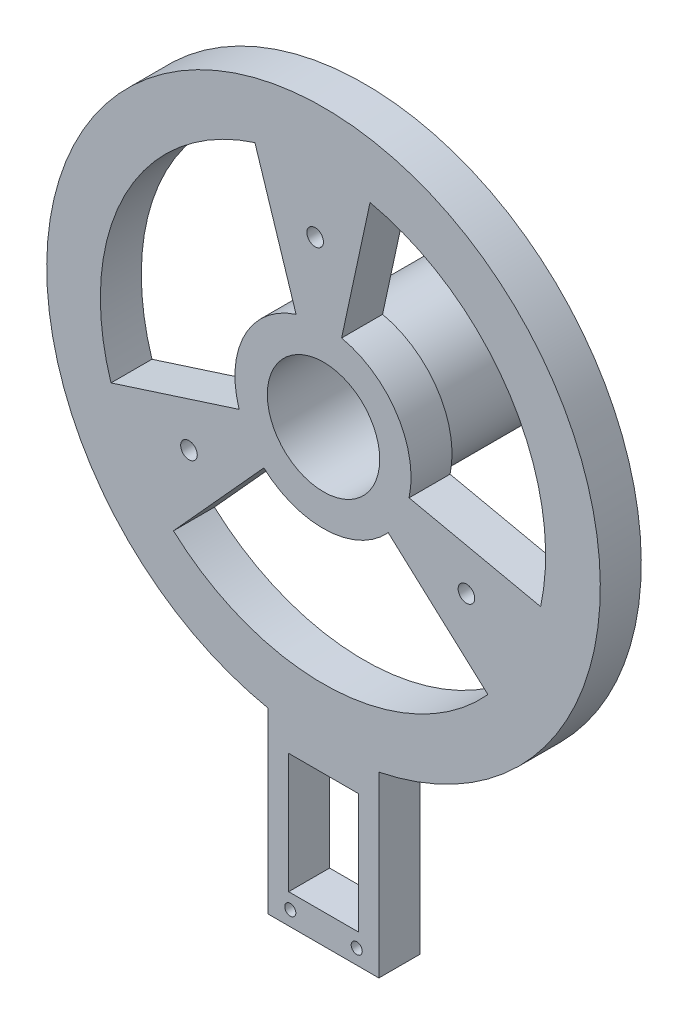
ISO-10303-21;
HEADER;
FILE_DESCRIPTION(('STEP AP214'),'2;1');
FILE_NAME('part.step','',(''),(''),'','','');
FILE_SCHEMA(('AUTOMOTIVE_DESIGN { 1 0 10303 214 1 1 1 1 }'));
ENDSEC;
DATA;
#1=APPLICATION_CONTEXT('core data for automotive mechanical design processes');
#2=APPLICATION_PROTOCOL_DEFINITION('international standard','automotive_design',2000,#1);
#3=PRODUCT_CONTEXT('',#1,'mechanical');
#4=PRODUCT('Part','Part','',(#3));
#5=PRODUCT_RELATED_PRODUCT_CATEGORY('part','',(#4));
#6=PRODUCT_DEFINITION_FORMATION('','',#4);
#7=PRODUCT_DEFINITION_CONTEXT('part definition',#1,'design');
#8=PRODUCT_DEFINITION('design','',#6,#7);
#9=PRODUCT_DEFINITION_SHAPE('','',#8);
#10=(LENGTH_UNIT() NAMED_UNIT(*) SI_UNIT(.MILLI.,.METRE.));
#11=(NAMED_UNIT(*) PLANE_ANGLE_UNIT() SI_UNIT($,.RADIAN.));
#12=(NAMED_UNIT(*) SI_UNIT($,.STERADIAN.) SOLID_ANGLE_UNIT());
#13=UNCERTAINTY_MEASURE_WITH_UNIT(LENGTH_MEASURE(1.E-05),#10,'distance_accuracy_value','');
#14=(GEOMETRIC_REPRESENTATION_CONTEXT(3) GLOBAL_UNCERTAINTY_ASSIGNED_CONTEXT((#13)) GLOBAL_UNIT_ASSIGNED_CONTEXT((#10,
#11,#12)) REPRESENTATION_CONTEXT('',''));
#15=CARTESIAN_POINT('',(0.,0.,0.));
#16=DIRECTION('',(0.,0.,1.));
#17=DIRECTION('',(1.,0.,0.));
#18=AXIS2_PLACEMENT_3D('',#15,#16,#17);
#19=CARTESIAN_POINT('',(6.10000000000001,74.3,5.));
#20=DIRECTION('',(0.,0.,1.));
#21=DIRECTION('',(1.,0.,0.));
#22=AXIS2_PLACEMENT_3D('',#19,#20,#21);
#23=PLANE('',#22);
#24=DIRECTION('',(-0.952103066891042,-0.305777288261689,0.));
#25=VECTOR('',#24,1.);
#26=CARTESIAN_POINT('',(-9.14217656474021,69.4350148088019,5.));
#27=LINE('',#26,#25);
#28=CARTESIAN_POINT('',(-9.14217656474021,69.4350148088019,5.));
#29=VERTEX_POINT('',#28);
#30=CARTESIAN_POINT('',(-32.2881338884713,62.0014623807209,5.));
#31=VERTEX_POINT('',#30);
#32=EDGE_CURVE('E203',#29,#31,#27,.T.);
#33=ORIENTED_EDGE('',*,*,#32,.T.);
#34=CARTESIAN_POINT('',(6.00499750192864,74.2996791208893,5.));
#35=DIRECTION('',(0.,0.,1.));
#36=DIRECTION('',(1.,0.,0.));
#37=AXIS2_PLACEMENT_3D('',#34,#35,#36);
#38=CIRCLE('',#37,40.2195232029246);
#39=CARTESIAN_POINT('',(-6.29321923824014,112.592810511289,5.));
#40=VERTEX_POINT('',#39);
#41=EDGE_CURVE('E195',#31,#40,#38,.F.);
#42=ORIENTED_EDGE('',*,*,#41,.T.);
#43=DIRECTION('',(0.305777288261699,-0.952103066891039,0.));
#44=VECTOR('',#43,1.);
#45=CARTESIAN_POINT('',(1.14033318984112,89.446853187558,5.));
#46=LINE('',#45,#44);
#47=CARTESIAN_POINT('',(1.14033318984112,89.446853187558,5.));
#48=VERTEX_POINT('',#47);
#49=EDGE_CURVE('E182',#40,#48,#46,.T.);
#50=ORIENTED_EDGE('',*,*,#49,.T.);
#51=CARTESIAN_POINT('',(6.00499750192864,74.2996791208893,5.));
#52=DIRECTION('',(0.,0.,1.));
#53=DIRECTION('',(1.,0.,0.));
#54=AXIS2_PLACEMENT_3D('',#51,#52,#53);
#55=CIRCLE('',#54,15.9091747452614);
#56=EDGE_CURVE('E209',#48,#29,#55,.T.);
#57=ORIENTED_EDGE('',*,*,#56,.T.);
#58=EDGE_LOOP('',(#33,#42,#50,#57));
#59=FACE_BOUND('',#58,.T.);
#60=CARTESIAN_POINT('',(31.9176827119807,61.1410219315247,5.));
#61=DIRECTION('',(0.,0.,1.));
#62=DIRECTION('',(1.,0.,0.));
#63=AXIS2_PLACEMENT_3D('',#60,#61,#62);
#64=CIRCLE('',#63,1.49999999999998);
#65=CARTESIAN_POINT('',(33.4176827119806,61.1410219315247,5.));
#66=VERTEX_POINT('',#65);
#67=EDGE_CURVE('E357',#66,#66,#64,.T.);
#68=ORIENTED_EDGE('',*,*,#67,.F.);
#69=EDGE_LOOP('',(#68));
#70=FACE_BOUND('',#69,.T.);
#71=CARTESIAN_POINT('',(4.58716714607769,103.238257161536,5.));
#72=DIRECTION('',(0.,0.,1.));
#73=DIRECTION('',(1.,0.,0.));
#74=AXIS2_PLACEMENT_3D('',#71,#72,#73);
#75=CIRCLE('',#74,1.49999999999999);
#76=CARTESIAN_POINT('',(6.08716714607768,103.238257161536,5.));
#77=VERTEX_POINT('',#76);
#78=EDGE_CURVE('E361',#77,#77,#75,.T.);
#79=ORIENTED_EDGE('',*,*,#78,.F.);
#80=EDGE_LOOP('',(#79));
#81=FACE_BOUND('',#80,.T.);
#82=CARTESIAN_POINT('',(-18.2048502092501,58.5207187679325,5.));
#83=DIRECTION('',(0.,0.,1.));
#84=DIRECTION('',(1.,0.,0.));
#85=AXIS2_PLACEMENT_3D('',#82,#83,#84);
#86=CIRCLE('',#85,1.50000000000001);
#87=CARTESIAN_POINT('',(-16.70485020925,58.5207187679325,5.));
#88=VERTEX_POINT('',#87);
#89=EDGE_CURVE('E365',#88,#88,#86,.T.);
#90=ORIENTED_EDGE('',*,*,#89,.F.);
#91=EDGE_LOOP('',(#90));
#92=FACE_BOUND('',#91,.T.);
#93=DIRECTION('',(-1.,0.,0.));
#94=VECTOR('',#93,1.);
#95=CARTESIAN_POINT('',(-3.90000000000061,-1.54999999999999,5.));
#96=LINE('',#95,#94);
#97=CARTESIAN_POINT('',(12.4000000000006,-1.54999999999999,5.));
#98=VERTEX_POINT('',#97);
#99=CARTESIAN_POINT('',(-0.200000000000618,-1.54999999999999,5.));
#100=VERTEX_POINT('',#99);
#101=EDGE_CURVE('E306',#98,#100,#96,.T.);
#102=ORIENTED_EDGE('',*,*,#101,.T.);
#103=DIRECTION('',(0.,1.,0.));
#104=VECTOR('',#103,1.);
#105=CARTESIAN_POINT('',(-0.200000000000618,-5.89999999999999,5.));
#106=LINE('',#105,#104);
#107=CARTESIAN_POINT('',(-0.200000000000616,20.1,5.));
#108=VERTEX_POINT('',#107);
#109=EDGE_CURVE('E312',#100,#108,#106,.T.);
#110=ORIENTED_EDGE('',*,*,#109,.T.);
#111=DIRECTION('',(-1.,0.,0.));
#112=VECTOR('',#111,1.);
#113=CARTESIAN_POINT('',(16.1,20.1,5.));
#114=LINE('',#113,#112);
#115=CARTESIAN_POINT('',(12.4000000000006,20.1,5.));
#116=VERTEX_POINT('',#115);
#117=EDGE_CURVE('E329',#116,#108,#114,.T.);
#118=ORIENTED_EDGE('',*,*,#117,.F.);
#119=DIRECTION('',(0.,1.,0.));
#120=VECTOR('',#119,1.);
#121=CARTESIAN_POINT('',(12.4000000000006,-5.89999999999999,5.));
#122=LINE('',#121,#120);
#123=EDGE_CURVE('E322',#98,#116,#122,.T.);
#124=ORIENTED_EDGE('',*,*,#123,.F.);
#125=EDGE_LOOP('',(#102,#110,#118,#124));
#126=FACE_BOUND('',#125,.T.);
#127=CARTESIAN_POINT('',(12.1,-4.22499999999998,5.));
#128=DIRECTION('',(0.,0.,1.));
#129=DIRECTION('',(-1.,0.,0.));
#130=AXIS2_PLACEMENT_3D('',#127,#128,#129);
#131=CIRCLE('',#130,1.);
#132=CARTESIAN_POINT('',(11.1,-4.22499999999998,5.));
#133=VERTEX_POINT('',#132);
#134=EDGE_CURVE('E288',#133,#133,#131,.T.);
#135=ORIENTED_EDGE('',*,*,#134,.F.);
#136=EDGE_LOOP('',(#135));
#137=FACE_BOUND('',#136,.T.);
#138=CARTESIAN_POINT('',(0.100000000000009,-4.22499999999999,5.));
#139=DIRECTION('',(0.,0.,1.));
#140=DIRECTION('',(1.,0.,0.));
#141=AXIS2_PLACEMENT_3D('',#138,#139,#140);
#142=CIRCLE('',#141,1.);
#143=CARTESIAN_POINT('',(1.10000000000001,-4.22499999999999,5.));
#144=VERTEX_POINT('',#143);
#145=EDGE_CURVE('E284',#144,#144,#142,.T.);
#146=ORIENTED_EDGE('',*,*,#145,.F.);
#147=EDGE_LOOP('',(#146));
#148=FACE_BOUND('',#147,.T.);
#149=DIRECTION('',(0.,1.,0.));
#150=VECTOR('',#149,1.);
#151=CARTESIAN_POINT('',(16.1,22.2019065307039,5.));
#152=LINE('',#151,#150);
#153=CARTESIAN_POINT('',(16.1,-6.89999999999999,5.));
#154=VERTEX_POINT('',#153);
#155=CARTESIAN_POINT('',(16.1,25.3102051443364,5.));
#156=VERTEX_POINT('',#155);
#157=EDGE_CURVE('E339',#154,#156,#152,.T.);
#158=ORIENTED_EDGE('',*,*,#157,.T.);
#159=CARTESIAN_POINT('',(6.10000000000001,74.3,5.));
#160=DIRECTION('',(0.,0.,1.));
#161=DIRECTION('',(1.,0.,0.));
#162=AXIS2_PLACEMENT_3D('',#159,#160,#161);
#163=CIRCLE('',#162,50.);
#164=CARTESIAN_POINT('',(-3.89999999999999,25.3102051443365,5.));
#165=VERTEX_POINT('',#164);
#166=EDGE_CURVE('E373',#156,#165,#163,.T.);
#167=ORIENTED_EDGE('',*,*,#166,.T.);
#168=DIRECTION('',(0.,-1.,0.));
#169=VECTOR('',#168,1.);
#170=CARTESIAN_POINT('',(-3.89999999999999,22.2019065307039,5.));
#171=LINE('',#170,#169);
#172=CARTESIAN_POINT('',(-3.89999999999999,-6.89999999999999,5.));
#173=VERTEX_POINT('',#172);
#174=EDGE_CURVE('E342',#165,#173,#171,.T.);
#175=ORIENTED_EDGE('',*,*,#174,.T.);
#176=DIRECTION('',(1.,0.,0.));
#177=VECTOR('',#176,1.);
#178=CARTESIAN_POINT('',(-3.89999999999999,-6.89999999999999,5.));
#179=LINE('',#178,#177);
#180=EDGE_CURVE('E287',#173,#154,#179,.T.);
#181=ORIENTED_EDGE('',*,*,#180,.T.);
#182=EDGE_LOOP('',(#158,#167,#175,#181));
#183=FACE_BOUND('',#182,.T.);
#184=DIRECTION('',(0.740862432980465,-0.671656798817868,0.));
#185=VECTOR('',#184,1.);
#186=CARTESIAN_POINT('',(17.7915074104143,63.6141737396529,5.));
#187=LINE('',#186,#185);
#188=CARTESIAN_POINT('',(17.7915074104143,63.6141737396529,5.));
#189=VERTEX_POINT('',#188);
#190=CARTESIAN_POINT('',(35.8021313153616,47.2859629164319,5.));
#191=VERTEX_POINT('',#190);
#192=EDGE_CURVE('E254',#189,#191,#187,.T.);
#193=ORIENTED_EDGE('',*,*,#192,.T.);
#194=CARTESIAN_POINT('',(6.00499750192864,74.2996791208893,5.));
#195=DIRECTION('',(0.,0.,1.));
#196=DIRECTION('',(1.,0.,0.));
#197=AXIS2_PLACEMENT_3D('',#194,#195,#196);
#198=CIRCLE('',#197,40.2195232029246);
#199=CARTESIAN_POINT('',(-21.0087187025284,44.502545307456,5.));
#200=VERTEX_POINT('',#199);
#201=EDGE_CURVE('E275',#191,#200,#198,.F.);
#202=ORIENTED_EDGE('',*,*,#201,.T.);
#203=DIRECTION('',(0.671656798817862,0.74086243298047,0.));
#204=VECTOR('',#203,1.);
#205=CARTESIAN_POINT('',(-4.68050787930757,62.5131692124035,5.));
#206=LINE('',#205,#204);
#207=CARTESIAN_POINT('',(-4.68050787930757,62.5131692124035,5.));
#208=VERTEX_POINT('',#207);
#209=EDGE_CURVE('E271',#200,#208,#206,.T.);
#210=ORIENTED_EDGE('',*,*,#209,.T.);
#211=CARTESIAN_POINT('',(6.00499750192864,74.2996791208893,5.));
#212=DIRECTION('',(0.,0.,1.));
#213=DIRECTION('',(1.,0.,0.));
#214=AXIS2_PLACEMENT_3D('',#211,#212,#213);
#215=CIRCLE('',#214,15.9091747452614);
#216=EDGE_CURVE('E266',#208,#189,#215,.T.);
#217=ORIENTED_EDGE('',*,*,#216,.T.);
#218=EDGE_LOOP('',(#193,#202,#210,#217));
#219=FACE_BOUND('',#218,.T.);
#220=DIRECTION('',(-0.977434087079562,0.211240633910577,0.));
#221=VECTOR('',#220,1.);
#222=CARTESIAN_POINT('',(21.5551671952524,70.9390149627061,5.));
#223=LINE('',#222,#221);
#224=CARTESIAN_POINT('',(45.3169304465545,65.8036815439223,5.));
#225=VERTEX_POINT('',#224);
#226=CARTESIAN_POINT('',(21.5551671952524,70.9390149627061,5.));
#227=VERTEX_POINT('',#226);
#228=EDGE_CURVE('E226',#225,#227,#223,.T.);
#229=ORIENTED_EDGE('',*,*,#228,.T.);
#230=CARTESIAN_POINT('',(6.00499750192864,74.2996791208893,5.));
#231=DIRECTION('',(0.,0.,1.));
#232=DIRECTION('',(1.,0.,0.));
#233=AXIS2_PLACEMENT_3D('',#230,#231,#232);
#234=CIRCLE('',#233,15.9091747452614);
#235=CARTESIAN_POINT('',(9.36566166011166,89.849848814213,5.));
#236=VERTEX_POINT('',#235);
#237=EDGE_CURVE('E227',#227,#236,#234,.T.);
#238=ORIENTED_EDGE('',*,*,#237,.T.);
#239=DIRECTION('',(0.211240633910569,0.977434087079564,0.));
#240=VECTOR('',#239,1.);
#241=CARTESIAN_POINT('',(9.36566166011166,89.849848814213,5.));
#242=LINE('',#241,#240);
#243=CARTESIAN_POINT('',(14.5009950788953,113.611612065515,5.));
#244=VERTEX_POINT('',#243);
#245=EDGE_CURVE('E230',#236,#244,#242,.T.);
#246=ORIENTED_EDGE('',*,*,#245,.T.);
#247=CARTESIAN_POINT('',(6.00499750192864,74.2996791208893,5.));
#248=DIRECTION('',(0.,0.,1.));
#249=DIRECTION('',(1.,0.,0.));
#250=AXIS2_PLACEMENT_3D('',#247,#248,#249);
#251=CIRCLE('',#250,40.2195232029246);
#252=EDGE_CURVE('E222',#244,#225,#251,.F.);
#253=ORIENTED_EDGE('',*,*,#252,.T.);
#254=EDGE_LOOP('',(#229,#238,#246,#253));
#255=FACE_BOUND('',#254,.T.);
#256=CARTESIAN_POINT('',(6.10000000000001,74.3,5.));
#257=DIRECTION('',(0.,0.,1.));
#258=DIRECTION('',(1.,0.,0.));
#259=AXIS2_PLACEMENT_3D('',#256,#257,#258);
#260=CIRCLE('',#259,10.15);
#261=CARTESIAN_POINT('',(16.25,74.3,5.));
#262=VERTEX_POINT('',#261);
#263=EDGE_CURVE('E539',#262,#262,#260,.F.);
#264=ORIENTED_EDGE('',*,*,#263,.T.);
#265=EDGE_LOOP('',(#264));
#266=FACE_BOUND('',#265,.T.);
#267=ADVANCED_FACE('F44',(#59,#70,#81,#92,#126,#137,#148,#183,#219,#255,#266),#23,.T.);
#268=CARTESIAN_POINT('',(-3.89999999999999,22.2019065307039,-22.7888699339858));
#269=DIRECTION('',(0.,-1.,0.));
#270=DIRECTION('',(0.,0.,-1.));
#271=AXIS2_PLACEMENT_3D('',#268,#269,#270);
#272=PLANE('',#271);
#273=CARTESIAN_POINT('',(2.60000000000826,22.2019065307039,0.0999999999999907));
#274=DIRECTION('',(0.,-1.,0.));
#275=DIRECTION('',(0.,0.,-1.));
#276=AXIS2_PLACEMENT_3D('',#273,#274,#275);
#277=CIRCLE('',#276,1.6);
#278=CARTESIAN_POINT('',(2.60000000000826,22.2019065307039,-1.50000000000001));
#279=VERTEX_POINT('',#278);
#280=EDGE_CURVE('E345',#279,#279,#277,.T.);
#281=ORIENTED_EDGE('',*,*,#280,.T.);
#282=EDGE_LOOP('',(#281));
#283=FACE_BOUND('',#282,.T.);
#284=ADVANCED_FACE('F397',(#283),#272,.T.);
#285=CARTESIAN_POINT('',(9.60000000000827,22.2019065307039,0.0999999999999907));
#286=DIRECTION('',(0.,-1.,0.));
#287=DIRECTION('',(0.,0.,-1.));
#288=AXIS2_PLACEMENT_3D('',#285,#286,#287);
#289=CIRCLE('',#288,1.6);
#290=CARTESIAN_POINT('',(9.60000000000827,22.2019065307039,-1.50000000000001));
#291=VERTEX_POINT('',#290);
#292=EDGE_CURVE('E335',#291,#291,#289,.T.);
#293=ORIENTED_EDGE('',*,*,#292,.T.);
#294=EDGE_LOOP('',(#293));
#295=FACE_BOUND('',#294,.T.);
#296=ADVANCED_FACE('F403',(#295),#272,.T.);
#297=CARTESIAN_POINT('',(2.60000000000826,28.3,0.0999999999999907));
#298=DIRECTION('',(0.,-1.,0.));
#299=DIRECTION('',(0.,0.,-1.));
#300=AXIS2_PLACEMENT_3D('',#297,#298,#299);
#301=CYLINDRICAL_SURFACE('',#300,1.6);
#302=ORIENTED_EDGE('',*,*,#280,.F.);
#303=EDGE_LOOP('',(#302));
#304=FACE_BOUND('',#303,.T.);
#305=CARTESIAN_POINT('',(2.60000000000826,20.1,0.0999999999999907));
#306=DIRECTION('',(0.,-1.,0.));
#307=DIRECTION('',(0.,0.,-1.));
#308=AXIS2_PLACEMENT_3D('',#305,#306,#307);
#309=CIRCLE('',#308,1.6);
#310=CARTESIAN_POINT('',(2.60000000000826,20.1,-1.50000000000001));
#311=VERTEX_POINT('',#310);
#312=EDGE_CURVE('E302',#311,#311,#309,.T.);
#313=ORIENTED_EDGE('',*,*,#312,.T.);
#314=EDGE_LOOP('',(#313));
#315=FACE_BOUND('',#314,.T.);
#316=ADVANCED_FACE('F399',(#304,#315),#301,.F.);
#317=CARTESIAN_POINT('',(9.60000000000827,28.3,0.0999999999999907));
#318=DIRECTION('',(0.,-1.,0.));
#319=DIRECTION('',(0.,0.,-1.));
#320=AXIS2_PLACEMENT_3D('',#317,#318,#319);
#321=CYLINDRICAL_SURFACE('',#320,1.6);
#322=ORIENTED_EDGE('',*,*,#292,.F.);
#323=EDGE_LOOP('',(#322));
#324=FACE_BOUND('',#323,.T.);
#325=CARTESIAN_POINT('',(9.60000000000827,20.1,0.0999999999999907));
#326=DIRECTION('',(0.,-1.,0.));
#327=DIRECTION('',(0.,0.,-1.));
#328=AXIS2_PLACEMENT_3D('',#325,#326,#327);
#329=CIRCLE('',#328,1.6);
#330=CARTESIAN_POINT('',(9.60000000000827,20.1,-1.50000000000001));
#331=VERTEX_POINT('',#330);
#332=EDGE_CURVE('E303',#331,#331,#329,.T.);
#333=ORIENTED_EDGE('',*,*,#332,.T.);
#334=EDGE_LOOP('',(#333));
#335=FACE_BOUND('',#334,.T.);
#336=ADVANCED_FACE('F402',(#324,#335),#321,.F.);
#337=CARTESIAN_POINT('',(-3.90000000000061,-1.54999999999999,25.4675963415358));
#338=DIRECTION('',(0.,1.,0.));
#339=DIRECTION('',(-1.,0.,0.));
#340=AXIS2_PLACEMENT_3D('',#337,#338,#339);
#341=PLANE('',#340);
#342=DIRECTION('',(1.,0.,0.));
#343=VECTOR('',#342,1.);
#344=CARTESIAN_POINT('',(-3.90000000000061,-1.54999999999999,-2.4));
#345=LINE('',#344,#343);
#346=CARTESIAN_POINT('',(-0.200000000000615,-1.54999999999999,-2.4));
#347=VERTEX_POINT('',#346);
#348=CARTESIAN_POINT('',(12.4000000000006,-1.54999999999999,-2.4));
#349=VERTEX_POINT('',#348);
#350=EDGE_CURVE('E48',#347,#349,#345,.T.);
#351=ORIENTED_EDGE('',*,*,#350,.F.);
#352=DIRECTION('',(0.,0.,-1.));
#353=VECTOR('',#352,1.);
#354=CARTESIAN_POINT('',(-0.200000000000615,-1.54999999999999,-2.4));
#355=LINE('',#354,#353);
#356=EDGE_CURVE('E332',#100,#347,#355,.T.);
#357=ORIENTED_EDGE('',*,*,#356,.F.);
#358=ORIENTED_EDGE('',*,*,#101,.F.);
#359=DIRECTION('',(0.,0.,1.));
#360=VECTOR('',#359,1.);
#361=CARTESIAN_POINT('',(12.4000000000006,-1.54999999999999,-2.4));
#362=LINE('',#361,#360);
#363=EDGE_CURVE('E310',#349,#98,#362,.T.);
#364=ORIENTED_EDGE('',*,*,#363,.F.);
#365=EDGE_LOOP('',(#351,#357,#358,#364));
#366=FACE_BOUND('',#365,.T.);
#367=ADVANCED_FACE('F433',(#366),#341,.T.);
#368=CARTESIAN_POINT('',(-18.2048502092501,58.5207187679325,-30.4));
#369=DIRECTION('',(0.,0.,1.));
#370=DIRECTION('',(1.,0.,0.));
#371=AXIS2_PLACEMENT_3D('',#368,#369,#370);
#372=CYLINDRICAL_SURFACE('',#371,1.50000000000001);
#373=ORIENTED_EDGE('',*,*,#89,.T.);
#374=EDGE_LOOP('',(#373));
#375=FACE_BOUND('',#374,.T.);
#376=CARTESIAN_POINT('',(-18.2048502092501,58.5207187679325,-2.4));
#377=DIRECTION('',(0.,0.,1.));
#378=DIRECTION('',(1.,0.,0.));
#379=AXIS2_PLACEMENT_3D('',#376,#377,#378);
#380=CIRCLE('',#379,1.50000000000001);
#381=CARTESIAN_POINT('',(-16.70485020925,58.5207187679325,-2.4));
#382=VERTEX_POINT('',#381);
#383=EDGE_CURVE('E366',#382,#382,#380,.T.);
#384=ORIENTED_EDGE('',*,*,#383,.F.);
#385=EDGE_LOOP('',(#384));
#386=FACE_BOUND('',#385,.T.);
#387=ADVANCED_FACE('F435',(#375,#386),#372,.F.);
#388=CARTESIAN_POINT('',(4.58716714607769,103.238257161536,-30.4));
#389=DIRECTION('',(0.,0.,1.));
#390=DIRECTION('',(1.,0.,0.));
#391=AXIS2_PLACEMENT_3D('',#388,#389,#390);
#392=CYLINDRICAL_SURFACE('',#391,1.49999999999999);
#393=ORIENTED_EDGE('',*,*,#78,.T.);
#394=EDGE_LOOP('',(#393));
#395=FACE_BOUND('',#394,.T.);
#396=CARTESIAN_POINT('',(4.58716714607769,103.238257161536,-2.4));
#397=DIRECTION('',(0.,0.,1.));
#398=DIRECTION('',(1.,0.,0.));
#399=AXIS2_PLACEMENT_3D('',#396,#397,#398);
#400=CIRCLE('',#399,1.49999999999999);
#401=CARTESIAN_POINT('',(6.08716714607768,103.238257161536,-2.4));
#402=VERTEX_POINT('',#401);
#403=EDGE_CURVE('E362',#402,#402,#400,.T.);
#404=ORIENTED_EDGE('',*,*,#403,.F.);
#405=EDGE_LOOP('',(#404));
#406=FACE_BOUND('',#405,.T.);
#407=ADVANCED_FACE('F442',(#395,#406),#392,.F.);
#408=CARTESIAN_POINT('',(31.9176827119807,61.1410219315247,-30.4));
#409=DIRECTION('',(0.,0.,1.));
#410=DIRECTION('',(1.,0.,0.));
#411=AXIS2_PLACEMENT_3D('',#408,#409,#410);
#412=CYLINDRICAL_SURFACE('',#411,1.49999999999998);
#413=ORIENTED_EDGE('',*,*,#67,.T.);
#414=EDGE_LOOP('',(#413));
#415=FACE_BOUND('',#414,.T.);
#416=CARTESIAN_POINT('',(31.9176827119807,61.1410219315247,-2.4));
#417=DIRECTION('',(0.,0.,1.));
#418=DIRECTION('',(1.,0.,0.));
#419=AXIS2_PLACEMENT_3D('',#416,#417,#418);
#420=CIRCLE('',#419,1.49999999999998);
#421=CARTESIAN_POINT('',(33.4176827119806,61.1410219315247,-2.4));
#422=VERTEX_POINT('',#421);
#423=EDGE_CURVE('E358',#422,#422,#420,.T.);
#424=ORIENTED_EDGE('',*,*,#423,.F.);
#425=EDGE_LOOP('',(#424));
#426=FACE_BOUND('',#425,.T.);
#427=ADVANCED_FACE('F564',(#415,#426),#412,.F.);
#428=CARTESIAN_POINT('',(6.10000000000001,74.3,-17.4));
#429=DIRECTION('',(0.,0.,1.));
#430=DIRECTION('',(1.,0.,0.));
#431=AXIS2_PLACEMENT_3D('',#428,#429,#430);
#432=CYLINDRICAL_SURFACE('',#431,12.5);
#433=CARTESIAN_POINT('',(6.10000000000001,74.3,-2.4));
#434=DIRECTION('',(0.,0.,1.));
#435=DIRECTION('',(1.,0.,0.));
#436=AXIS2_PLACEMENT_3D('',#433,#434,#435);
#437=CIRCLE('',#436,12.5);
#438=CARTESIAN_POINT('',(18.6,74.3,-2.4));
#439=VERTEX_POINT('',#438);
#440=EDGE_CURVE('E381',#439,#439,#437,.F.);
#441=ORIENTED_EDGE('',*,*,#440,.T.);
#442=EDGE_LOOP('',(#441));
#443=FACE_BOUND('',#442,.T.);
#444=CARTESIAN_POINT('',(6.10000000000001,74.3,-24.4));
#445=DIRECTION('',(0.,0.,-1.));
#446=DIRECTION('',(-1.,0.,0.));
#447=AXIS2_PLACEMENT_3D('',#444,#445,#446);
#448=CIRCLE('',#447,12.5);
#449=CARTESIAN_POINT('',(-6.39999999999999,74.3,-24.4));
#450=VERTEX_POINT('',#449);
#451=EDGE_CURVE('E223',#450,#450,#448,.T.);
#452=ORIENTED_EDGE('',*,*,#451,.F.);
#453=EDGE_LOOP('',(#452));
#454=FACE_BOUND('',#453,.T.);
#455=ADVANCED_FACE('F561',(#443,#454),#432,.T.);
#456=CARTESIAN_POINT('',(-0.200000000000615,-5.89999999999999,-2.4));
#457=DIRECTION('',(-1.,0.,0.));
#458=DIRECTION('',(0.,0.,1.));
#459=AXIS2_PLACEMENT_3D('',#456,#457,#458);
#460=PLANE('',#459);
#461=ORIENTED_EDGE('',*,*,#356,.T.);
#462=DIRECTION('',(0.,1.,0.));
#463=VECTOR('',#462,1.);
#464=CARTESIAN_POINT('',(-0.200000000000615,-5.89999999999999,-2.4));
#465=LINE('',#464,#463);
#466=CARTESIAN_POINT('',(-0.200000000000616,20.1,-2.4));
#467=VERTEX_POINT('',#466);
#468=EDGE_CURVE('E314',#347,#467,#465,.T.);
#469=ORIENTED_EDGE('',*,*,#468,.T.);
#470=DIRECTION('',(0.,0.,1.));
#471=VECTOR('',#470,1.);
#472=CARTESIAN_POINT('',(-0.200000000000615,20.1,-2.4));
#473=LINE('',#472,#471);
#474=EDGE_CURVE('E316',#467,#108,#473,.T.);
#475=ORIENTED_EDGE('',*,*,#474,.T.);
#476=ORIENTED_EDGE('',*,*,#109,.F.);
#477=EDGE_LOOP('',(#461,#469,#475,#476));
#478=FACE_BOUND('',#477,.T.);
#479=ADVANCED_FACE('F411',(#478),#460,.F.);
#480=CARTESIAN_POINT('',(0.,20.1,0.));
#481=DIRECTION('',(0.,1.,0.));
#482=DIRECTION('',(0.,0.,1.));
#483=AXIS2_PLACEMENT_3D('',#480,#481,#482);
#484=PLANE('',#483);
#485=ORIENTED_EDGE('',*,*,#332,.F.);
#486=EDGE_LOOP('',(#485));
#487=FACE_BOUND('',#486,.T.);
#488=ORIENTED_EDGE('',*,*,#312,.F.);
#489=EDGE_LOOP('',(#488));
#490=FACE_BOUND('',#489,.T.);
#491=ORIENTED_EDGE('',*,*,#474,.F.);
#492=DIRECTION('',(1.,0.,0.));
#493=VECTOR('',#492,1.);
#494=CARTESIAN_POINT('',(16.1000000000006,20.1,-2.4));
#495=LINE('',#494,#493);
#496=CARTESIAN_POINT('',(12.4000000000006,20.1,-2.4));
#497=VERTEX_POINT('',#496);
#498=EDGE_CURVE('E326',#467,#497,#495,.T.);
#499=ORIENTED_EDGE('',*,*,#498,.T.);
#500=DIRECTION('',(0.,0.,-1.));
#501=VECTOR('',#500,1.);
#502=CARTESIAN_POINT('',(12.4000000000006,20.1,-2.4));
#503=LINE('',#502,#501);
#504=EDGE_CURVE('E319',#116,#497,#503,.T.);
#505=ORIENTED_EDGE('',*,*,#504,.F.);
#506=ORIENTED_EDGE('',*,*,#117,.T.);
#507=EDGE_LOOP('',(#491,#499,#505,#506));
#508=FACE_BOUND('',#507,.T.);
#509=ADVANCED_FACE('F407',(#487,#490,#508),#484,.F.);
#510=CARTESIAN_POINT('',(12.4000000000006,-5.89999999999999,-2.4));
#511=DIRECTION('',(1.,0.,0.));
#512=DIRECTION('',(0.,0.,-1.));
#513=AXIS2_PLACEMENT_3D('',#510,#511,#512);
#514=PLANE('',#513);
#515=DIRECTION('',(0.,1.,0.));
#516=VECTOR('',#515,1.);
#517=CARTESIAN_POINT('',(12.4000000000006,-5.89999999999999,-2.4));
#518=LINE('',#517,#516);
#519=EDGE_CURVE('E324',#349,#497,#518,.T.);
#520=ORIENTED_EDGE('',*,*,#519,.F.);
#521=ORIENTED_EDGE('',*,*,#363,.T.);
#522=ORIENTED_EDGE('',*,*,#123,.T.);
#523=ORIENTED_EDGE('',*,*,#504,.T.);
#524=EDGE_LOOP('',(#520,#521,#522,#523));
#525=FACE_BOUND('',#524,.T.);
#526=ADVANCED_FACE('F410',(#525),#514,.F.);
#527=CARTESIAN_POINT('',(6.10000000000001,74.3,-2.4));
#528=DIRECTION('',(0.,0.,1.));
#529=DIRECTION('',(1.,0.,0.));
#530=AXIS2_PLACEMENT_3D('',#527,#528,#529);
#531=CYLINDRICAL_SURFACE('',#530,50.);
#532=DIRECTION('',(0.,0.,1.));
#533=VECTOR('',#532,1.);
#534=CARTESIAN_POINT('',(-3.89999999999999,25.3102051443365,-2.4));
#535=LINE('',#534,#533);
#536=CARTESIAN_POINT('',(-3.89999999999999,25.3102051443365,-2.4));
#537=VERTEX_POINT('',#536);
#538=EDGE_CURVE('E354',#165,#537,#535,.F.);
#539=ORIENTED_EDGE('',*,*,#538,.F.);
#540=ORIENTED_EDGE('',*,*,#166,.F.);
#541=DIRECTION('',(0.,0.,1.));
#542=VECTOR('',#541,1.);
#543=CARTESIAN_POINT('',(16.1,25.3102051443364,-2.4));
#544=LINE('',#543,#542);
#545=CARTESIAN_POINT('',(16.1,25.3102051443364,-2.4));
#546=VERTEX_POINT('',#545);
#547=EDGE_CURVE('E351',#546,#156,#544,.T.);
#548=ORIENTED_EDGE('',*,*,#547,.F.);
#549=CARTESIAN_POINT('',(6.10000000000001,74.3,-2.4));
#550=DIRECTION('',(0.,0.,1.));
#551=DIRECTION('',(1.,0.,0.));
#552=AXIS2_PLACEMENT_3D('',#549,#550,#551);
#553=CIRCLE('',#552,50.);
#554=EDGE_CURVE('E378',#546,#537,#553,.T.);
#555=ORIENTED_EDGE('',*,*,#554,.T.);
#556=EDGE_LOOP('',(#539,#540,#548,#555));
#557=FACE_BOUND('',#556,.T.);
#558=ADVANCED_FACE('F46',(#557),#531,.T.);
#559=CARTESIAN_POINT('',(-3.89999999999999,22.2019065307039,-22.7888699339858));
#560=DIRECTION('',(-1.,0.,0.));
#561=DIRECTION('',(0.,0.,1.));
#562=AXIS2_PLACEMENT_3D('',#559,#560,#561);
#563=PLANE('',#562);
#564=DIRECTION('',(0.,1.,0.));
#565=VECTOR('',#564,1.);
#566=CARTESIAN_POINT('',(-3.89999999999999,22.2019065307039,-2.4));
#567=LINE('',#566,#565);
#568=CARTESIAN_POINT('',(-3.89999999999999,-6.89999999999999,-2.4));
#569=VERTEX_POINT('',#568);
#570=EDGE_CURVE('E338',#569,#537,#567,.T.);
#571=ORIENTED_EDGE('',*,*,#570,.F.);
#572=DIRECTION('',(0.,0.,1.));
#573=VECTOR('',#572,1.);
#574=CARTESIAN_POINT('',(-3.89999999999999,-6.89999999999999,-50.4249843945008));
#575=LINE('',#574,#573);
#576=EDGE_CURVE('E300',#569,#173,#575,.T.);
#577=ORIENTED_EDGE('',*,*,#576,.T.);
#578=ORIENTED_EDGE('',*,*,#174,.F.);
#579=ORIENTED_EDGE('',*,*,#538,.T.);
#580=EDGE_LOOP('',(#571,#577,#578,#579));
#581=FACE_BOUND('',#580,.T.);
#582=ADVANCED_FACE('F486',(#581),#563,.T.);
#583=CARTESIAN_POINT('',(12.1,-4.22499999999998,-5.22842712474619));
#584=DIRECTION('',(0.,0.,1.));
#585=DIRECTION('',(1.,0.,0.));
#586=AXIS2_PLACEMENT_3D('',#583,#584,#585);
#587=CYLINDRICAL_SURFACE('',#586,1.);
#588=CARTESIAN_POINT('',(12.1,-4.22499999999998,-2.4));
#589=DIRECTION('',(0.,0.,1.));
#590=DIRECTION('',(1.,0.,0.));
#591=AXIS2_PLACEMENT_3D('',#588,#589,#590);
#592=CIRCLE('',#591,1.);
#593=CARTESIAN_POINT('',(13.1,-4.22499999999998,-2.4));
#594=VERTEX_POINT('',#593);
#595=EDGE_CURVE('E291',#594,#594,#592,.F.);
#596=ORIENTED_EDGE('',*,*,#595,.T.);
#597=EDGE_LOOP('',(#596));
#598=FACE_BOUND('',#597,.T.);
#599=ORIENTED_EDGE('',*,*,#134,.T.);
#600=EDGE_LOOP('',(#599));
#601=FACE_BOUND('',#600,.T.);
#602=ADVANCED_FACE('F483',(#598,#601),#587,.F.);
#603=CARTESIAN_POINT('',(0.100000000000009,-4.22499999999999,-5.22842712474619));
#604=DIRECTION('',(0.,0.,1.));
#605=DIRECTION('',(1.,0.,0.));
#606=AXIS2_PLACEMENT_3D('',#603,#604,#605);
#607=CYLINDRICAL_SURFACE('',#606,1.);
#608=CARTESIAN_POINT('',(0.100000000000009,-4.22499999999999,-2.4));
#609=DIRECTION('',(0.,0.,1.));
#610=DIRECTION('',(1.,0.,0.));
#611=AXIS2_PLACEMENT_3D('',#608,#609,#610);
#612=CIRCLE('',#611,1.);
#613=CARTESIAN_POINT('',(1.10000000000001,-4.22499999999999,-2.4));
#614=VERTEX_POINT('',#613);
#615=EDGE_CURVE('E283',#614,#614,#612,.F.);
#616=ORIENTED_EDGE('',*,*,#615,.T.);
#617=EDGE_LOOP('',(#616));
#618=FACE_BOUND('',#617,.T.);
#619=ORIENTED_EDGE('',*,*,#145,.T.);
#620=EDGE_LOOP('',(#619));
#621=FACE_BOUND('',#620,.T.);
#622=ADVANCED_FACE('F478',(#618,#621),#607,.F.);
#623=CARTESIAN_POINT('',(16.1,22.2019065307039,-22.7888699339858));
#624=DIRECTION('',(1.,0.,0.));
#625=DIRECTION('',(0.,0.,-1.));
#626=AXIS2_PLACEMENT_3D('',#623,#624,#625);
#627=PLANE('',#626);
#628=DIRECTION('',(0.,0.,1.));
#629=VECTOR('',#628,1.);
#630=CARTESIAN_POINT('',(16.1,-6.89999999999999,-50.4249843945008));
#631=LINE('',#630,#629);
#632=CARTESIAN_POINT('',(16.1,-6.89999999999999,-2.4));
#633=VERTEX_POINT('',#632);
#634=EDGE_CURVE('E298',#633,#154,#631,.T.);
#635=ORIENTED_EDGE('',*,*,#634,.F.);
#636=DIRECTION('',(0.,-1.,0.));
#637=VECTOR('',#636,1.);
#638=CARTESIAN_POINT('',(16.1,22.2019065307039,-2.4));
#639=LINE('',#638,#637);
#640=EDGE_CURVE('E336',#546,#633,#639,.T.);
#641=ORIENTED_EDGE('',*,*,#640,.F.);
#642=ORIENTED_EDGE('',*,*,#547,.T.);
#643=ORIENTED_EDGE('',*,*,#157,.F.);
#644=EDGE_LOOP('',(#635,#641,#642,#643));
#645=FACE_BOUND('',#644,.T.);
#646=ADVANCED_FACE('F468',(#645),#627,.T.);
#647=CARTESIAN_POINT('',(-3.89999999999999,-6.89999999999999,-50.4249843945008));
#648=DIRECTION('',(0.,-1.,0.));
#649=DIRECTION('',(0.,0.,-1.));
#650=AXIS2_PLACEMENT_3D('',#647,#648,#649);
#651=PLANE('',#650);
#652=DIRECTION('',(-1.,0.,0.));
#653=VECTOR('',#652,1.);
#654=CARTESIAN_POINT('',(-3.89999999999999,-6.89999999999999,-2.4));
#655=LINE('',#654,#653);
#656=EDGE_CURVE('E11',#633,#569,#655,.T.);
#657=ORIENTED_EDGE('',*,*,#656,.F.);
#658=ORIENTED_EDGE('',*,*,#634,.T.);
#659=ORIENTED_EDGE('',*,*,#180,.F.);
#660=ORIENTED_EDGE('',*,*,#576,.F.);
#661=EDGE_LOOP('',(#657,#658,#659,#660));
#662=FACE_BOUND('',#661,.T.);
#663=ADVANCED_FACE('F460',(#662),#651,.T.);
#664=CARTESIAN_POINT('',(17.7915074104143,63.6141737396529,69.0291409316649));
#665=DIRECTION('',(0.671656798817868,0.740862432980465,0.));
#666=DIRECTION('',(-0.740862432980465,0.671656798817868,0.));
#667=AXIS2_PLACEMENT_3D('',#664,#665,#666);
#668=PLANE('',#667);
#669=DIRECTION('',(0.,0.,-1.));
#670=VECTOR('',#669,1.);
#671=CARTESIAN_POINT('',(17.7915074104143,63.6141737396529,69.0291409316649));
#672=LINE('',#671,#670);
#673=CARTESIAN_POINT('',(17.7915074104143,63.6141737396529,-2.4));
#674=VERTEX_POINT('',#673);
#675=EDGE_CURVE('E269',#189,#674,#672,.T.);
#676=ORIENTED_EDGE('',*,*,#675,.T.);
#677=DIRECTION('',(0.740862432980465,-0.671656798817868,0.));
#678=VECTOR('',#677,1.);
#679=CARTESIAN_POINT('',(17.7915074104143,63.6141737396529,-2.4));
#680=LINE('',#679,#678);
#681=CARTESIAN_POINT('',(35.8021313153616,47.2859629164319,-2.4));
#682=VERTEX_POINT('',#681);
#683=EDGE_CURVE('E258',#674,#682,#680,.T.);
#684=ORIENTED_EDGE('',*,*,#683,.T.);
#685=DIRECTION('',(0.,0.,-1.));
#686=VECTOR('',#685,1.);
#687=CARTESIAN_POINT('',(35.8021313153616,47.2859629164319,69.0291409316649));
#688=LINE('',#687,#686);
#689=EDGE_CURVE('E265',#191,#682,#688,.T.);
#690=ORIENTED_EDGE('',*,*,#689,.F.);
#691=ORIENTED_EDGE('',*,*,#192,.F.);
#692=EDGE_LOOP('',(#676,#684,#690,#691));
#693=FACE_BOUND('',#692,.T.);
#694=ADVANCED_FACE('F466',(#693),#668,.F.);
#695=CARTESIAN_POINT('',(6.00499750192864,74.2996791208893,69.0291409316649));
#696=DIRECTION('',(0.,0.,-1.));
#697=DIRECTION('',(-1.,0.,0.));
#698=AXIS2_PLACEMENT_3D('',#695,#696,#697);
#699=CYLINDRICAL_SURFACE('',#698,40.2195232029246);
#700=ORIENTED_EDGE('',*,*,#689,.T.);
#701=CARTESIAN_POINT('',(6.00499750192864,74.2996791208893,-2.4));
#702=DIRECTION('',(0.,0.,-1.));
#703=DIRECTION('',(-1.,0.,0.));
#704=AXIS2_PLACEMENT_3D('',#701,#702,#703);
#705=CIRCLE('',#704,40.2195232029246);
#706=CARTESIAN_POINT('',(-21.0087187025284,44.502545307456,-2.4));
#707=VERTEX_POINT('',#706);
#708=EDGE_CURVE('E255',#682,#707,#705,.T.);
#709=ORIENTED_EDGE('',*,*,#708,.T.);
#710=DIRECTION('',(0.,0.,-1.));
#711=VECTOR('',#710,1.);
#712=CARTESIAN_POINT('',(-21.0087187025284,44.502545307456,69.0291409316649));
#713=LINE('',#712,#711);
#714=EDGE_CURVE('E274',#200,#707,#713,.T.);
#715=ORIENTED_EDGE('',*,*,#714,.F.);
#716=ORIENTED_EDGE('',*,*,#201,.F.);
#717=EDGE_LOOP('',(#700,#709,#715,#716));
#718=FACE_BOUND('',#717,.T.);
#719=ADVANCED_FACE('F475',(#718),#699,.F.);
#720=CARTESIAN_POINT('',(-4.68050787930757,62.5131692124035,69.0291409316649));
#721=DIRECTION('',(-0.74086243298047,0.671656798817862,0.));
#722=DIRECTION('',(-0.671656798817862,-0.74086243298047,0.));
#723=AXIS2_PLACEMENT_3D('',#720,#721,#722);
#724=PLANE('',#723);
#725=ORIENTED_EDGE('',*,*,#714,.T.);
#726=DIRECTION('',(0.671656798817862,0.74086243298047,0.));
#727=VECTOR('',#726,1.);
#728=CARTESIAN_POINT('',(-4.68050787930757,62.5131692124035,-2.4));
#729=LINE('',#728,#727);
#730=CARTESIAN_POINT('',(-4.68050787930757,62.5131692124035,-2.4));
#731=VERTEX_POINT('',#730);
#732=EDGE_CURVE('E252',#707,#731,#729,.T.);
#733=ORIENTED_EDGE('',*,*,#732,.T.);
#734=DIRECTION('',(0.,0.,-1.));
#735=VECTOR('',#734,1.);
#736=CARTESIAN_POINT('',(-4.68050787930757,62.5131692124035,69.0291409316649));
#737=LINE('',#736,#735);
#738=EDGE_CURVE('E270',#208,#731,#737,.T.);
#739=ORIENTED_EDGE('',*,*,#738,.F.);
#740=ORIENTED_EDGE('',*,*,#209,.F.);
#741=EDGE_LOOP('',(#725,#733,#739,#740));
#742=FACE_BOUND('',#741,.T.);
#743=ADVANCED_FACE('F493',(#742),#724,.F.);
#744=CARTESIAN_POINT('',(6.00499750192864,74.2996791208893,69.0291409316649));
#745=DIRECTION('',(0.,0.,-1.));
#746=DIRECTION('',(-1.,0.,0.));
#747=AXIS2_PLACEMENT_3D('',#744,#745,#746);
#748=CYLINDRICAL_SURFACE('',#747,15.9091747452614);
#749=ORIENTED_EDGE('',*,*,#738,.T.);
#750=CARTESIAN_POINT('',(6.00499750192864,74.2996791208893,-2.4));
#751=DIRECTION('',(0.,0.,1.));
#752=DIRECTION('',(-1.,0.,0.));
#753=AXIS2_PLACEMENT_3D('',#750,#751,#752);
#754=CIRCLE('',#753,15.9091747452614);
#755=EDGE_CURVE('E215',#731,#674,#754,.T.);
#756=ORIENTED_EDGE('',*,*,#755,.T.);
#757=ORIENTED_EDGE('',*,*,#675,.F.);
#758=ORIENTED_EDGE('',*,*,#216,.F.);
#759=EDGE_LOOP('',(#749,#756,#757,#758));
#760=FACE_BOUND('',#759,.T.);
#761=ADVANCED_FACE('F497',(#760),#748,.T.);
#762=CARTESIAN_POINT('',(-9.14217656474021,69.4350148088019,69.0291409316649));
#763=DIRECTION('',(0.305777288261689,-0.952103066891042,0.));
#764=DIRECTION('',(0.952103066891042,0.305777288261689,0.));
#765=AXIS2_PLACEMENT_3D('',#762,#763,#764);
#766=PLANE('',#765);
#767=DIRECTION('',(0.,0.,-1.));
#768=VECTOR('',#767,1.);
#769=CARTESIAN_POINT('',(-9.14217656474021,69.4350148088019,69.0291409316649));
#770=LINE('',#769,#768);
#771=CARTESIAN_POINT('',(-9.14217656474021,69.4350148088019,-2.4));
#772=VERTEX_POINT('',#771);
#773=EDGE_CURVE('E68',#29,#772,#770,.T.);
#774=ORIENTED_EDGE('',*,*,#773,.T.);
#775=DIRECTION('',(-0.952103066891042,-0.305777288261689,0.));
#776=VECTOR('',#775,1.);
#777=CARTESIAN_POINT('',(-9.14217656474021,69.4350148088019,-2.4));
#778=LINE('',#777,#776);
#779=CARTESIAN_POINT('',(-32.2881338884713,62.0014623807209,-2.4));
#780=VERTEX_POINT('',#779);
#781=EDGE_CURVE('E216',#772,#780,#778,.T.);
#782=ORIENTED_EDGE('',*,*,#781,.T.);
#783=DIRECTION('',(0.,0.,-1.));
#784=VECTOR('',#783,1.);
#785=CARTESIAN_POINT('',(-32.2881338884713,62.0014623807209,69.0291409316649));
#786=LINE('',#785,#784);
#787=EDGE_CURVE('E204',#31,#780,#786,.T.);
#788=ORIENTED_EDGE('',*,*,#787,.F.);
#789=ORIENTED_EDGE('',*,*,#32,.F.);
#790=EDGE_LOOP('',(#774,#782,#788,#789));
#791=FACE_BOUND('',#790,.T.);
#792=ADVANCED_FACE('F501',(#791),#766,.F.);
#793=CARTESIAN_POINT('',(6.00499750192864,74.2996791208893,69.0291409316649));
#794=DIRECTION('',(0.,0.,-1.));
#795=DIRECTION('',(-1.,0.,0.));
#796=AXIS2_PLACEMENT_3D('',#793,#794,#795);
#797=CYLINDRICAL_SURFACE('',#796,40.2195232029246);
#798=ORIENTED_EDGE('',*,*,#787,.T.);
#799=CARTESIAN_POINT('',(6.00499750192864,74.2996791208893,-2.4));
#800=DIRECTION('',(0.,0.,-1.));
#801=DIRECTION('',(-1.,0.,0.));
#802=AXIS2_PLACEMENT_3D('',#799,#800,#801);
#803=CIRCLE('',#802,40.2195232029246);
#804=CARTESIAN_POINT('',(-6.29321923824014,112.592810511289,-2.4));
#805=VERTEX_POINT('',#804);
#806=EDGE_CURVE('E198',#780,#805,#803,.T.);
#807=ORIENTED_EDGE('',*,*,#806,.T.);
#808=DIRECTION('',(0.,0.,-1.));
#809=VECTOR('',#808,1.);
#810=CARTESIAN_POINT('',(-6.29321923824014,112.592810511289,69.0291409316649));
#811=LINE('',#810,#809);
#812=EDGE_CURVE('E185',#40,#805,#811,.T.);
#813=ORIENTED_EDGE('',*,*,#812,.F.);
#814=ORIENTED_EDGE('',*,*,#41,.F.);
#815=EDGE_LOOP('',(#798,#807,#813,#814));
#816=FACE_BOUND('',#815,.T.);
#817=ADVANCED_FACE('F194',(#816),#797,.F.);
#818=CARTESIAN_POINT('',(1.14033318984112,89.446853187558,69.0291409316649));
#819=DIRECTION('',(0.952103066891039,0.305777288261699,0.));
#820=DIRECTION('',(-0.305777288261699,0.952103066891039,0.));
#821=AXIS2_PLACEMENT_3D('',#818,#819,#820);
#822=PLANE('',#821);
#823=ORIENTED_EDGE('',*,*,#812,.T.);
#824=DIRECTION('',(0.305777288261699,-0.952103066891039,0.));
#825=VECTOR('',#824,1.);
#826=CARTESIAN_POINT('',(1.14033318984112,89.446853187558,-2.4));
#827=LINE('',#826,#825);
#828=CARTESIAN_POINT('',(1.14033318984112,89.446853187558,-2.4));
#829=VERTEX_POINT('',#828);
#830=EDGE_CURVE('E212',#805,#829,#827,.T.);
#831=ORIENTED_EDGE('',*,*,#830,.T.);
#832=DIRECTION('',(0.,0.,-1.));
#833=VECTOR('',#832,1.);
#834=CARTESIAN_POINT('',(1.14033318984112,89.446853187558,69.0291409316649));
#835=LINE('',#834,#833);
#836=EDGE_CURVE('E188',#48,#829,#835,.T.);
#837=ORIENTED_EDGE('',*,*,#836,.F.);
#838=ORIENTED_EDGE('',*,*,#49,.F.);
#839=EDGE_LOOP('',(#823,#831,#837,#838));
#840=FACE_BOUND('',#839,.T.);
#841=ADVANCED_FACE('F184',(#840),#822,.F.);
#842=CARTESIAN_POINT('',(6.00499750192864,74.2996791208893,69.0291409316649));
#843=DIRECTION('',(0.,0.,-1.));
#844=DIRECTION('',(-1.,0.,0.));
#845=AXIS2_PLACEMENT_3D('',#842,#843,#844);
#846=CYLINDRICAL_SURFACE('',#845,15.9091747452614);
#847=ORIENTED_EDGE('',*,*,#836,.T.);
#848=CARTESIAN_POINT('',(6.00499750192864,74.2996791208893,-2.4));
#849=DIRECTION('',(0.,0.,1.));
#850=DIRECTION('',(-1.,0.,0.));
#851=AXIS2_PLACEMENT_3D('',#848,#849,#850);
#852=CIRCLE('',#851,15.9091747452614);
#853=EDGE_CURVE('E213',#829,#772,#852,.T.);
#854=ORIENTED_EDGE('',*,*,#853,.T.);
#855=ORIENTED_EDGE('',*,*,#773,.F.);
#856=ORIENTED_EDGE('',*,*,#56,.F.);
#857=EDGE_LOOP('',(#847,#854,#855,#856));
#858=FACE_BOUND('',#857,.T.);
#859=ADVANCED_FACE('F517',(#858),#846,.T.);
#860=CARTESIAN_POINT('',(21.5551671952524,70.9390149627061,69.0291409316649));
#861=DIRECTION('',(-0.211240633910577,-0.977434087079562,0.));
#862=DIRECTION('',(0.977434087079562,-0.211240633910577,0.));
#863=AXIS2_PLACEMENT_3D('',#860,#861,#862);
#864=PLANE('',#863);
#865=DIRECTION('',(0.,0.,-1.));
#866=VECTOR('',#865,1.);
#867=CARTESIAN_POINT('',(45.3169304465546,65.8036815439223,69.0291409316649));
#868=LINE('',#867,#866);
#869=CARTESIAN_POINT('',(45.3169304465546,65.8036815439223,-2.4));
#870=VERTEX_POINT('',#869);
#871=EDGE_CURVE('E60',#225,#870,#868,.T.);
#872=ORIENTED_EDGE('',*,*,#871,.T.);
#873=DIRECTION('',(-0.977434087079562,0.211240633910577,0.));
#874=VECTOR('',#873,1.);
#875=CARTESIAN_POINT('',(21.5551671952524,70.9390149627061,-2.4));
#876=LINE('',#875,#874);
#877=CARTESIAN_POINT('',(21.5551671952524,70.9390149627061,-2.4));
#878=VERTEX_POINT('',#877);
#879=EDGE_CURVE('E245',#870,#878,#876,.T.);
#880=ORIENTED_EDGE('',*,*,#879,.T.);
#881=DIRECTION('',(0.,0.,-1.));
#882=VECTOR('',#881,1.);
#883=CARTESIAN_POINT('',(21.5551671952524,70.9390149627061,69.0291409316649));
#884=LINE('',#883,#882);
#885=EDGE_CURVE('E224',#227,#878,#884,.T.);
#886=ORIENTED_EDGE('',*,*,#885,.F.);
#887=ORIENTED_EDGE('',*,*,#228,.F.);
#888=EDGE_LOOP('',(#872,#880,#886,#887));
#889=FACE_BOUND('',#888,.T.);
#890=ADVANCED_FACE('F513',(#889),#864,.F.);
#891=CARTESIAN_POINT('',(6.00499750192864,74.2996791208893,69.0291409316649));
#892=DIRECTION('',(0.,0.,-1.));
#893=DIRECTION('',(-1.,0.,0.));
#894=AXIS2_PLACEMENT_3D('',#891,#892,#893);
#895=CYLINDRICAL_SURFACE('',#894,15.9091747452614);
#896=ORIENTED_EDGE('',*,*,#885,.T.);
#897=CARTESIAN_POINT('',(6.00499750192864,74.2996791208893,-2.4));
#898=DIRECTION('',(0.,0.,1.));
#899=DIRECTION('',(-1.,0.,0.));
#900=AXIS2_PLACEMENT_3D('',#897,#898,#899);
#901=CIRCLE('',#900,15.9091747452614);
#902=CARTESIAN_POINT('',(9.36566166011166,89.849848814213,-2.4));
#903=VERTEX_POINT('',#902);
#904=EDGE_CURVE('E248',#878,#903,#901,.T.);
#905=ORIENTED_EDGE('',*,*,#904,.T.);
#906=DIRECTION('',(0.,0.,-1.));
#907=VECTOR('',#906,1.);
#908=CARTESIAN_POINT('',(9.36566166011166,89.849848814213,69.0291409316649));
#909=LINE('',#908,#907);
#910=EDGE_CURVE('E228',#236,#903,#909,.T.);
#911=ORIENTED_EDGE('',*,*,#910,.F.);
#912=ORIENTED_EDGE('',*,*,#237,.F.);
#913=EDGE_LOOP('',(#896,#905,#911,#912));
#914=FACE_BOUND('',#913,.T.);
#915=ADVANCED_FACE('F509',(#914),#895,.T.);
#916=CARTESIAN_POINT('',(9.36566166011166,89.849848814213,69.0291409316649));
#917=DIRECTION('',(-0.977434087079564,0.211240633910569,0.));
#918=DIRECTION('',(-0.211240633910569,-0.977434087079564,0.));
#919=AXIS2_PLACEMENT_3D('',#916,#917,#918);
#920=PLANE('',#919);
#921=ORIENTED_EDGE('',*,*,#910,.T.);
#922=DIRECTION('',(0.211240633910569,0.977434087079564,0.));
#923=VECTOR('',#922,1.);
#924=CARTESIAN_POINT('',(9.36566166011166,89.849848814213,-2.4));
#925=LINE('',#924,#923);
#926=CARTESIAN_POINT('',(14.5009950788953,113.611612065515,-2.4));
#927=VERTEX_POINT('',#926);
#928=EDGE_CURVE('E242',#903,#927,#925,.T.);
#929=ORIENTED_EDGE('',*,*,#928,.T.);
#930=DIRECTION('',(0.,0.,-1.));
#931=VECTOR('',#930,1.);
#932=CARTESIAN_POINT('',(14.5009950788953,113.611612065515,69.0291409316649));
#933=LINE('',#932,#931);
#934=EDGE_CURVE('E231',#244,#927,#933,.T.);
#935=ORIENTED_EDGE('',*,*,#934,.F.);
#936=ORIENTED_EDGE('',*,*,#245,.F.);
#937=EDGE_LOOP('',(#921,#929,#935,#936));
#938=FACE_BOUND('',#937,.T.);
#939=ADVANCED_FACE('F506',(#938),#920,.F.);
#940=CARTESIAN_POINT('',(6.00499750192864,74.2996791208893,69.0291409316649));
#941=DIRECTION('',(0.,0.,-1.));
#942=DIRECTION('',(-1.,0.,0.));
#943=AXIS2_PLACEMENT_3D('',#940,#941,#942);
#944=CYLINDRICAL_SURFACE('',#943,40.2195232029246);
#945=ORIENTED_EDGE('',*,*,#934,.T.);
#946=CARTESIAN_POINT('',(6.00499750192864,74.2996791208893,-2.4));
#947=DIRECTION('',(0.,0.,-1.));
#948=DIRECTION('',(-1.,0.,0.));
#949=AXIS2_PLACEMENT_3D('',#946,#947,#948);
#950=CIRCLE('',#949,40.2195232029246);
#951=EDGE_CURVE('E243',#927,#870,#950,.T.);
#952=ORIENTED_EDGE('',*,*,#951,.T.);
#953=ORIENTED_EDGE('',*,*,#871,.F.);
#954=ORIENTED_EDGE('',*,*,#252,.F.);
#955=EDGE_LOOP('',(#945,#952,#953,#954));
#956=FACE_BOUND('',#955,.T.);
#957=ADVANCED_FACE('F503',(#956),#944,.F.);
#958=CARTESIAN_POINT('',(6.10000000000001,74.3,-24.4));
#959=DIRECTION('',(0.,0.,-1.));
#960=DIRECTION('',(-1.,0.,0.));
#961=AXIS2_PLACEMENT_3D('',#958,#959,#960);
#962=PLANE('',#961);
#963=ORIENTED_EDGE('',*,*,#451,.T.);
#964=EDGE_LOOP('',(#963));
#965=FACE_BOUND('',#964,.T.);
#966=CARTESIAN_POINT('',(6.10000000000001,74.3,-24.4));
#967=DIRECTION('',(0.,0.,-1.));
#968=DIRECTION('',(-1.,0.,0.));
#969=AXIS2_PLACEMENT_3D('',#966,#967,#968);
#970=CIRCLE('',#969,10.15);
#971=CARTESIAN_POINT('',(-4.04999999999999,74.3,-24.4));
#972=VERTEX_POINT('',#971);
#973=EDGE_CURVE('E538',#972,#972,#970,.T.);
#974=ORIENTED_EDGE('',*,*,#973,.F.);
#975=EDGE_LOOP('',(#974));
#976=FACE_BOUND('',#975,.T.);
#977=ADVANCED_FACE('F455',(#965,#976),#962,.T.);
#978=CARTESIAN_POINT('',(6.10000000000001,74.3,36.7614479109644));
#979=DIRECTION('',(0.,0.,-1.));
#980=DIRECTION('',(-1.,0.,0.));
#981=AXIS2_PLACEMENT_3D('',#978,#979,#980);
#982=CYLINDRICAL_SURFACE('',#981,10.15);
#983=ORIENTED_EDGE('',*,*,#973,.T.);
#984=EDGE_LOOP('',(#983));
#985=FACE_BOUND('',#984,.T.);
#986=ORIENTED_EDGE('',*,*,#263,.F.);
#987=EDGE_LOOP('',(#986));
#988=FACE_BOUND('',#987,.T.);
#989=ADVANCED_FACE('F450',(#985,#988),#982,.F.);
#990=CARTESIAN_POINT('',(6.10000000000001,74.3,-2.4));
#991=DIRECTION('',(0.,0.,1.));
#992=DIRECTION('',(1.,0.,0.));
#993=AXIS2_PLACEMENT_3D('',#990,#991,#992);
#994=PLANE('',#993);
#995=ORIENTED_EDGE('',*,*,#498,.F.);
#996=ORIENTED_EDGE('',*,*,#468,.F.);
#997=ORIENTED_EDGE('',*,*,#350,.T.);
#998=ORIENTED_EDGE('',*,*,#519,.T.);
#999=EDGE_LOOP('',(#995,#996,#997,#998));
#1000=FACE_BOUND('',#999,.T.);
#1001=ORIENTED_EDGE('',*,*,#570,.T.);
#1002=ORIENTED_EDGE('',*,*,#554,.F.);
#1003=ORIENTED_EDGE('',*,*,#640,.T.);
#1004=ORIENTED_EDGE('',*,*,#656,.T.);
#1005=EDGE_LOOP('',(#1001,#1002,#1003,#1004));
#1006=FACE_BOUND('',#1005,.T.);
#1007=ORIENTED_EDGE('',*,*,#595,.F.);
#1008=EDGE_LOOP('',(#1007));
#1009=FACE_BOUND('',#1008,.T.);
#1010=ORIENTED_EDGE('',*,*,#615,.F.);
#1011=EDGE_LOOP('',(#1010));
#1012=FACE_BOUND('',#1011,.T.);
#1013=ORIENTED_EDGE('',*,*,#904,.F.);
#1014=ORIENTED_EDGE('',*,*,#879,.F.);
#1015=ORIENTED_EDGE('',*,*,#951,.F.);
#1016=ORIENTED_EDGE('',*,*,#928,.F.);
#1017=EDGE_LOOP('',(#1013,#1014,#1015,#1016));
#1018=FACE_BOUND('',#1017,.T.);
#1019=ORIENTED_EDGE('',*,*,#806,.F.);
#1020=ORIENTED_EDGE('',*,*,#781,.F.);
#1021=ORIENTED_EDGE('',*,*,#853,.F.);
#1022=ORIENTED_EDGE('',*,*,#830,.F.);
#1023=EDGE_LOOP('',(#1019,#1020,#1021,#1022));
#1024=FACE_BOUND('',#1023,.T.);
#1025=ORIENTED_EDGE('',*,*,#708,.F.);
#1026=ORIENTED_EDGE('',*,*,#683,.F.);
#1027=ORIENTED_EDGE('',*,*,#755,.F.);
#1028=ORIENTED_EDGE('',*,*,#732,.F.);
#1029=EDGE_LOOP('',(#1025,#1026,#1027,#1028));
#1030=FACE_BOUND('',#1029,.T.);
#1031=ORIENTED_EDGE('',*,*,#383,.T.);
#1032=EDGE_LOOP('',(#1031));
#1033=FACE_BOUND('',#1032,.T.);
#1034=ORIENTED_EDGE('',*,*,#403,.T.);
#1035=EDGE_LOOP('',(#1034));
#1036=FACE_BOUND('',#1035,.T.);
#1037=ORIENTED_EDGE('',*,*,#423,.T.);
#1038=EDGE_LOOP('',(#1037));
#1039=FACE_BOUND('',#1038,.T.);
#1040=ORIENTED_EDGE('',*,*,#440,.F.);
#1041=EDGE_LOOP('',(#1040));
#1042=FACE_BOUND('',#1041,.T.);
#1043=ADVANCED_FACE('F421',(#1000,#1006,#1009,#1012,#1018,#1024,#1030,#1033,#1036,#1039,#1042),
#994,.F.);
#1044=CLOSED_SHELL('',(#267,#284,#296,#316,#336,#367,#387,#407,#427,#455,#479,#509,#526,#558,
#582,#602,#622,#646,#663,#694,#719,#743,#761,#792,#817,#841,#859,#890,#915,#939,#957,#977,#989,#1043));
#1045=CARTESIAN_POINT('',(9.60000000000827,28.3,0.0999999999999907));
#1046=DIRECTION('',(0.,-1.,0.));
#1047=DIRECTION('',(0.,0.,-1.));
#1048=AXIS2_PLACEMENT_3D('',#1045,#1046,#1047);
#1049=PLANE('',#1048);
#1050=CARTESIAN_POINT('',(9.60000000000827,28.3,0.0999999999999907));
#1051=DIRECTION('',(0.,-1.,0.));
#1052=DIRECTION('',(0.,0.,-1.));
#1053=AXIS2_PLACEMENT_3D('',#1050,#1051,#1052);
#1054=CIRCLE('',#1053,1.6);
#1055=CARTESIAN_POINT('',(9.60000000000827,28.3,-1.50000000000001));
#1056=VERTEX_POINT('',#1055);
#1057=EDGE_CURVE('E370',#1056,#1056,#1054,.T.);
#1058=ORIENTED_EDGE('',*,*,#1057,.T.);
#1059=EDGE_LOOP('',(#1058));
#1060=FACE_BOUND('',#1059,.T.);
#1061=ADVANCED_FACE('F588',(#1060),#1049,.T.);
#1062=CARTESIAN_POINT('',(9.60000000000827,28.3,0.0999999999999907));
#1063=DIRECTION('',(0.,-1.,0.));
#1064=DIRECTION('',(0.,0.,-1.));
#1065=AXIS2_PLACEMENT_3D('',#1062,#1063,#1064);
#1066=CYLINDRICAL_SURFACE('',#1065,1.6);
#1067=CARTESIAN_POINT('',(9.60000000000827,26.1649883094452,0.0999999999999907));
#1068=DIRECTION('',(0.,1.,0.));
#1069=DIRECTION('',(0.,0.,1.));
#1070=AXIS2_PLACEMENT_3D('',#1067,#1068,#1069);
#1071=CIRCLE('',#1070,1.6);
#1072=CARTESIAN_POINT('',(9.60000000000827,26.1649883094452,1.69999999999999));
#1073=VERTEX_POINT('',#1072);
#1074=EDGE_CURVE('E341',#1073,#1073,#1071,.F.);
#1075=ORIENTED_EDGE('',*,*,#1074,.T.);
#1076=EDGE_LOOP('',(#1075));
#1077=FACE_BOUND('',#1076,.T.);
#1078=ORIENTED_EDGE('',*,*,#1057,.F.);
#1079=EDGE_LOOP('',(#1078));
#1080=FACE_BOUND('',#1079,.T.);
#1081=ADVANCED_FACE('F584',(#1077,#1080),#1066,.F.);
#1082=CARTESIAN_POINT('',(-3.89999999999999,26.1649883094452,-22.7888699339858));
#1083=DIRECTION('',(0.,1.,0.));
#1084=DIRECTION('',(0.,0.,1.));
#1085=AXIS2_PLACEMENT_3D('',#1082,#1083,#1084);
#1086=PLANE('',#1085);
#1087=ORIENTED_EDGE('',*,*,#1074,.F.);
#1088=EDGE_LOOP('',(#1087));
#1089=FACE_BOUND('',#1088,.T.);
#1090=ADVANCED_FACE('F587',(#1089),#1086,.T.);
#1091=CLOSED_SHELL('',(#1061,#1081,#1090));
#1092=CARTESIAN_POINT('',(2.60000000000826,28.3,0.0999999999999907));
#1093=DIRECTION('',(0.,-1.,0.));
#1094=DIRECTION('',(0.,0.,-1.));
#1095=AXIS2_PLACEMENT_3D('',#1092,#1093,#1094);
#1096=PLANE('',#1095);
#1097=CARTESIAN_POINT('',(2.60000000000826,28.3,0.0999999999999907));
#1098=DIRECTION('',(0.,-1.,0.));
#1099=DIRECTION('',(0.,0.,-1.));
#1100=AXIS2_PLACEMENT_3D('',#1097,#1098,#1099);
#1101=CIRCLE('',#1100,1.6);
#1102=CARTESIAN_POINT('',(2.60000000000826,28.3,-1.50000000000001));
#1103=VERTEX_POINT('',#1102);
#1104=EDGE_CURVE('E369',#1103,#1103,#1101,.T.);
#1105=ORIENTED_EDGE('',*,*,#1104,.T.);
#1106=EDGE_LOOP('',(#1105));
#1107=FACE_BOUND('',#1106,.T.);
#1108=ADVANCED_FACE('F573',(#1107),#1096,.T.);
#1109=CARTESIAN_POINT('',(2.60000000000826,28.3,0.0999999999999907));
#1110=DIRECTION('',(0.,-1.,0.));
#1111=DIRECTION('',(0.,0.,-1.));
#1112=AXIS2_PLACEMENT_3D('',#1109,#1110,#1111);
#1113=CYLINDRICAL_SURFACE('',#1112,1.6);
#1114=CARTESIAN_POINT('',(2.60000000000826,26.1649883094452,0.0999999999999907));
#1115=DIRECTION('',(0.,1.,0.));
#1116=DIRECTION('',(0.,0.,1.));
#1117=AXIS2_PLACEMENT_3D('',#1114,#1115,#1116);
#1118=CIRCLE('',#1117,1.6);
#1119=CARTESIAN_POINT('',(2.60000000000826,26.1649883094452,1.69999999999999));
#1120=VERTEX_POINT('',#1119);
#1121=EDGE_CURVE('E348',#1120,#1120,#1118,.F.);
#1122=ORIENTED_EDGE('',*,*,#1121,.T.);
#1123=EDGE_LOOP('',(#1122));
#1124=FACE_BOUND('',#1123,.T.);
#1125=ORIENTED_EDGE('',*,*,#1104,.F.);
#1126=EDGE_LOOP('',(#1125));
#1127=FACE_BOUND('',#1126,.T.);
#1128=ADVANCED_FACE('F576',(#1124,#1127),#1113,.F.);
#1129=ORIENTED_EDGE('',*,*,#1121,.F.);
#1130=EDGE_LOOP('',(#1129));
#1131=FACE_BOUND('',#1130,.T.);
#1132=ADVANCED_FACE('F582',(#1131),#1086,.T.);
#1133=CLOSED_SHELL('',(#1108,#1128,#1132));
#1134=ORIENTED_CLOSED_SHELL('',*,#1091,.T.);
#1135=ORIENTED_CLOSED_SHELL('',*,#1133,.T.);
#1136=BREP_WITH_VOIDS('B2',#1044,(#1134,#1135));
#1137=ADVANCED_BREP_SHAPE_REPRESENTATION('',(#18,#1136),#14);
#1138=SHAPE_DEFINITION_REPRESENTATION(#9,#1137);
ENDSEC;
END-ISO-10303-21;
